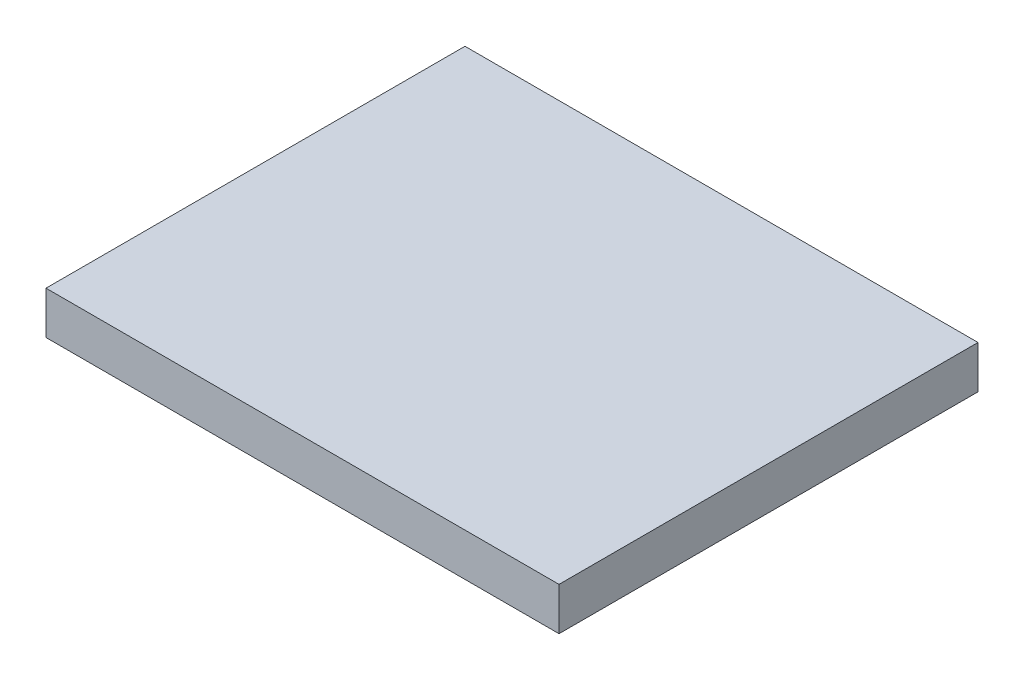
ISO-10303-21;
HEADER;
FILE_DESCRIPTION(('STEP AP214'),'2;1');
FILE_NAME('part.step','',(''),(''),'','','');
FILE_SCHEMA(('AUTOMOTIVE_DESIGN { 1 0 10303 214 1 1 1 1 }'));
ENDSEC;
DATA;
#1=APPLICATION_CONTEXT('core data for automotive mechanical design processes');
#2=APPLICATION_PROTOCOL_DEFINITION('international standard','automotive_design',2000,#1);
#3=PRODUCT_CONTEXT('',#1,'mechanical');
#4=PRODUCT('Part','Part','',(#3));
#5=PRODUCT_RELATED_PRODUCT_CATEGORY('part','',(#4));
#6=PRODUCT_DEFINITION_FORMATION('','',#4);
#7=PRODUCT_DEFINITION_CONTEXT('part definition',#1,'design');
#8=PRODUCT_DEFINITION('design','',#6,#7);
#9=PRODUCT_DEFINITION_SHAPE('','',#8);
#10=(LENGTH_UNIT() NAMED_UNIT(*) SI_UNIT(.MILLI.,.METRE.));
#11=(NAMED_UNIT(*) PLANE_ANGLE_UNIT() SI_UNIT($,.RADIAN.));
#12=(NAMED_UNIT(*) SI_UNIT($,.STERADIAN.) SOLID_ANGLE_UNIT());
#13=UNCERTAINTY_MEASURE_WITH_UNIT(LENGTH_MEASURE(1.E-05),#10,'distance_accuracy_value','');
#14=(GEOMETRIC_REPRESENTATION_CONTEXT(3) GLOBAL_UNCERTAINTY_ASSIGNED_CONTEXT((#13)) GLOBAL_UNIT_ASSIGNED_CONTEXT((#10,
#11,#12)) REPRESENTATION_CONTEXT('',''));
#15=CARTESIAN_POINT('',(0.,0.,0.));
#16=DIRECTION('',(0.,0.,1.));
#17=DIRECTION('',(1.,0.,0.));
#18=AXIS2_PLACEMENT_3D('',#15,#16,#17);
#19=CARTESIAN_POINT('',(60.0000000000001,10.,-48.9999999999999));
#20=DIRECTION('',(-1.,0.,0.));
#21=DIRECTION('',(0.,0.,1.));
#22=AXIS2_PLACEMENT_3D('',#19,#20,#21);
#23=PLANE('',#22);
#24=DIRECTION('',(0.,0.,-1.));
#25=VECTOR('',#24,1.);
#26=CARTESIAN_POINT('',(60.0000000000001,0.,-48.9999999999999));
#27=LINE('',#26,#25);
#28=CARTESIAN_POINT('',(60.0000000000002,0.,48.9999999999999));
#29=VERTEX_POINT('',#28);
#30=CARTESIAN_POINT('',(60.0000000000001,0.,-48.9999999999999));
#31=VERTEX_POINT('',#30);
#32=EDGE_CURVE('E110',#29,#31,#27,.T.);
#33=ORIENTED_EDGE('',*,*,#32,.T.);
#34=DIRECTION('',(0.,-1.,0.));
#35=VECTOR('',#34,1.);
#36=CARTESIAN_POINT('',(60.0000000000001,10.,-48.9999999999999));
#37=LINE('',#36,#35);
#38=CARTESIAN_POINT('',(60.0000000000001,10.,-48.9999999999999));
#39=VERTEX_POINT('',#38);
#40=EDGE_CURVE('E11',#39,#31,#37,.T.);
#41=ORIENTED_EDGE('',*,*,#40,.F.);
#42=DIRECTION('',(0.,0.,-1.));
#43=VECTOR('',#42,1.);
#44=CARTESIAN_POINT('',(60.0000000000001,10.,-48.9999999999999));
#45=LINE('',#44,#43);
#46=CARTESIAN_POINT('',(60.0000000000002,10.,48.9999999999999));
#47=VERTEX_POINT('',#46);
#48=EDGE_CURVE('E98',#47,#39,#45,.T.);
#49=ORIENTED_EDGE('',*,*,#48,.F.);
#50=DIRECTION('',(0.,-1.,0.));
#51=VECTOR('',#50,1.);
#52=CARTESIAN_POINT('',(60.0000000000002,10.,48.9999999999999));
#53=LINE('',#52,#51);
#54=EDGE_CURVE('E106',#47,#29,#53,.T.);
#55=ORIENTED_EDGE('',*,*,#54,.T.);
#56=EDGE_LOOP('',(#33,#41,#49,#55));
#57=FACE_BOUND('',#56,.T.);
#58=ADVANCED_FACE('F47',(#57),#23,.F.);
#59=CARTESIAN_POINT('',(-60.,10.,-48.9999999999999));
#60=DIRECTION('',(0.,0.,1.));
#61=DIRECTION('',(1.,0.,0.));
#62=AXIS2_PLACEMENT_3D('',#59,#60,#61);
#63=PLANE('',#62);
#64=DIRECTION('',(-1.,0.,0.));
#65=VECTOR('',#64,1.);
#66=CARTESIAN_POINT('',(-60.,0.,-48.9999999999999));
#67=LINE('',#66,#65);
#68=CARTESIAN_POINT('',(-60.,0.,-48.9999999999999));
#69=VERTEX_POINT('',#68);
#70=EDGE_CURVE('E102',#31,#69,#67,.T.);
#71=ORIENTED_EDGE('',*,*,#70,.T.);
#72=DIRECTION('',(0.,-1.,0.));
#73=VECTOR('',#72,1.);
#74=CARTESIAN_POINT('',(-60.,10.,-48.9999999999999));
#75=LINE('',#74,#73);
#76=CARTESIAN_POINT('',(-60.,10.,-48.9999999999999));
#77=VERTEX_POINT('',#76);
#78=EDGE_CURVE('E55',#77,#69,#75,.T.);
#79=ORIENTED_EDGE('',*,*,#78,.F.);
#80=DIRECTION('',(-1.,0.,0.));
#81=VECTOR('',#80,1.);
#82=CARTESIAN_POINT('',(-60.,10.,-48.9999999999999));
#83=LINE('',#82,#81);
#84=EDGE_CURVE('E93',#39,#77,#83,.T.);
#85=ORIENTED_EDGE('',*,*,#84,.F.);
#86=ORIENTED_EDGE('',*,*,#40,.T.);
#87=EDGE_LOOP('',(#71,#79,#85,#86));
#88=FACE_BOUND('',#87,.T.);
#89=ADVANCED_FACE('F101',(#88),#63,.F.);
#90=CARTESIAN_POINT('',(-60.,10.,-48.9999999999999));
#91=DIRECTION('',(1.,0.,0.));
#92=DIRECTION('',(0.,0.,-1.));
#93=AXIS2_PLACEMENT_3D('',#90,#91,#92);
#94=PLANE('',#93);
#95=DIRECTION('',(0.,0.,1.));
#96=VECTOR('',#95,1.);
#97=CARTESIAN_POINT('',(-60.,0.,-48.9999999999999));
#98=LINE('',#97,#96);
#99=CARTESIAN_POINT('',(-60.,0.,48.9999999999999));
#100=VERTEX_POINT('',#99);
#101=EDGE_CURVE('E80',#69,#100,#98,.T.);
#102=ORIENTED_EDGE('',*,*,#101,.T.);
#103=DIRECTION('',(0.,-1.,0.));
#104=VECTOR('',#103,1.);
#105=CARTESIAN_POINT('',(-60.,10.,48.9999999999999));
#106=LINE('',#105,#104);
#107=CARTESIAN_POINT('',(-60.,10.,48.9999999999999));
#108=VERTEX_POINT('',#107);
#109=EDGE_CURVE('E103',#108,#100,#106,.T.);
#110=ORIENTED_EDGE('',*,*,#109,.F.);
#111=DIRECTION('',(0.,0.,1.));
#112=VECTOR('',#111,1.);
#113=CARTESIAN_POINT('',(-60.,10.,-48.9999999999999));
#114=LINE('',#113,#112);
#115=EDGE_CURVE('E96',#77,#108,#114,.T.);
#116=ORIENTED_EDGE('',*,*,#115,.F.);
#117=ORIENTED_EDGE('',*,*,#78,.T.);
#118=EDGE_LOOP('',(#102,#110,#116,#117));
#119=FACE_BOUND('',#118,.T.);
#120=ADVANCED_FACE('F104',(#119),#94,.F.);
#121=CARTESIAN_POINT('',(-60.,10.,48.9999999999999));
#122=DIRECTION('',(0.,0.,-1.));
#123=DIRECTION('',(-1.,0.,0.));
#124=AXIS2_PLACEMENT_3D('',#121,#122,#123);
#125=PLANE('',#124);
#126=DIRECTION('',(1.,0.,0.));
#127=VECTOR('',#126,1.);
#128=CARTESIAN_POINT('',(-60.,0.,48.9999999999999));
#129=LINE('',#128,#127);
#130=EDGE_CURVE('E86',#100,#29,#129,.T.);
#131=ORIENTED_EDGE('',*,*,#130,.T.);
#132=ORIENTED_EDGE('',*,*,#54,.F.);
#133=DIRECTION('',(1.,0.,0.));
#134=VECTOR('',#133,1.);
#135=CARTESIAN_POINT('',(-60.,10.,48.9999999999999));
#136=LINE('',#135,#134);
#137=EDGE_CURVE('E63',#108,#47,#136,.T.);
#138=ORIENTED_EDGE('',*,*,#137,.F.);
#139=ORIENTED_EDGE('',*,*,#109,.T.);
#140=EDGE_LOOP('',(#131,#132,#138,#139));
#141=FACE_BOUND('',#140,.T.);
#142=ADVANCED_FACE('F117',(#141),#125,.F.);
#143=CARTESIAN_POINT('',(0.,10.,0.));
#144=DIRECTION('',(0.,1.,0.));
#145=DIRECTION('',(0.,0.,1.));
#146=AXIS2_PLACEMENT_3D('',#143,#144,#145);
#147=PLANE('',#146);
#148=ORIENTED_EDGE('',*,*,#48,.T.);
#149=ORIENTED_EDGE('',*,*,#84,.T.);
#150=ORIENTED_EDGE('',*,*,#115,.T.);
#151=ORIENTED_EDGE('',*,*,#137,.T.);
#152=EDGE_LOOP('',(#148,#149,#150,#151));
#153=FACE_BOUND('',#152,.T.);
#154=ADVANCED_FACE('F94',(#153),#147,.T.);
#155=CARTESIAN_POINT('',(0.,0.,0.));
#156=DIRECTION('',(0.,1.,0.));
#157=DIRECTION('',(0.,0.,1.));
#158=AXIS2_PLACEMENT_3D('',#155,#156,#157);
#159=PLANE('',#158);
#160=ORIENTED_EDGE('',*,*,#32,.F.);
#161=ORIENTED_EDGE('',*,*,#130,.F.);
#162=ORIENTED_EDGE('',*,*,#101,.F.);
#163=ORIENTED_EDGE('',*,*,#70,.F.);
#164=EDGE_LOOP('',(#160,#161,#162,#163));
#165=FACE_BOUND('',#164,.T.);
#166=ADVANCED_FACE('F120',(#165),#159,.F.);
#167=CLOSED_SHELL('',(#58,#89,#120,#142,#154,#166));
#168=MANIFOLD_SOLID_BREP('B2',#167);
#169=ADVANCED_BREP_SHAPE_REPRESENTATION('',(#18,#168),#14);
#170=SHAPE_DEFINITION_REPRESENTATION(#9,#169);
ENDSEC;
END-ISO-10303-21;
